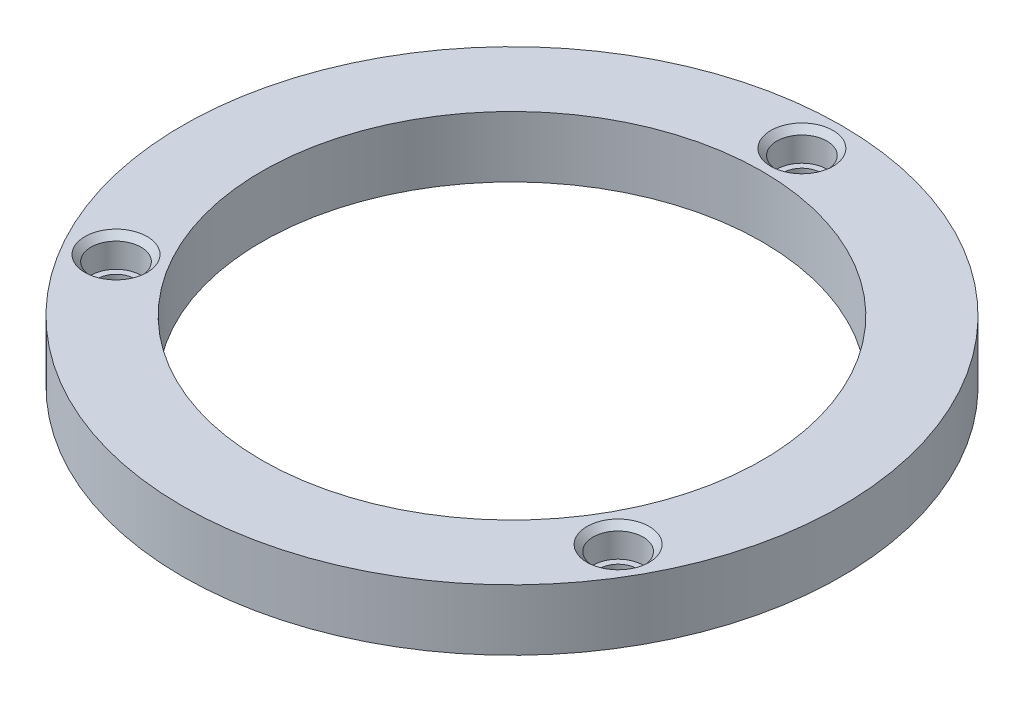
ISO-10303-21;
HEADER;
FILE_DESCRIPTION(('STEP AP214'),'2;1');
FILE_NAME('part.step','',(''),(''),'','','');
FILE_SCHEMA(('AUTOMOTIVE_DESIGN { 1 0 10303 214 1 1 1 1 }'));
ENDSEC;
DATA;
#1=APPLICATION_CONTEXT('core data for automotive mechanical design processes');
#2=APPLICATION_PROTOCOL_DEFINITION('international standard','automotive_design',2000,#1);
#3=PRODUCT_CONTEXT('',#1,'mechanical');
#4=PRODUCT('Part','Part','',(#3));
#5=PRODUCT_RELATED_PRODUCT_CATEGORY('part','',(#4));
#6=PRODUCT_DEFINITION_FORMATION('','',#4);
#7=PRODUCT_DEFINITION_CONTEXT('part definition',#1,'design');
#8=PRODUCT_DEFINITION('design','',#6,#7);
#9=PRODUCT_DEFINITION_SHAPE('','',#8);
#10=(LENGTH_UNIT() NAMED_UNIT(*) SI_UNIT(.MILLI.,.METRE.));
#11=(NAMED_UNIT(*) PLANE_ANGLE_UNIT() SI_UNIT($,.RADIAN.));
#12=(NAMED_UNIT(*) SI_UNIT($,.STERADIAN.) SOLID_ANGLE_UNIT());
#13=UNCERTAINTY_MEASURE_WITH_UNIT(LENGTH_MEASURE(1.E-05),#10,'distance_accuracy_value','');
#14=(GEOMETRIC_REPRESENTATION_CONTEXT(3) GLOBAL_UNCERTAINTY_ASSIGNED_CONTEXT((#13)) GLOBAL_UNIT_ASSIGNED_CONTEXT((#10,
#11,#12)) REPRESENTATION_CONTEXT('',''));
#15=CARTESIAN_POINT('',(0.,0.,0.));
#16=DIRECTION('',(0.,0.,1.));
#17=DIRECTION('',(1.,0.,0.));
#18=AXIS2_PLACEMENT_3D('',#15,#16,#17);
#19=CARTESIAN_POINT('',(0.,10.,0.));
#20=DIRECTION('',(0.,1.,0.));
#21=DIRECTION('',(0.,0.,1.));
#22=AXIS2_PLACEMENT_3D('',#19,#20,#21);
#23=PLANE('',#22);
#24=CARTESIAN_POINT('',(-41.1362066797608,10.,23.75));
#25=DIRECTION('',(0.,1.,0.));
#26=DIRECTION('',(0.,0.,1.));
#27=AXIS2_PLACEMENT_3D('',#24,#25,#26);
#28=CIRCLE('',#27,5.09999999999999);
#29=CARTESIAN_POINT('',(-41.1362066797608,10.,28.85));
#30=VERTEX_POINT('',#29);
#31=EDGE_CURVE('E45',#30,#30,#28,.F.);
#32=ORIENTED_EDGE('',*,*,#31,.T.);
#33=EDGE_LOOP('',(#32));
#34=FACE_BOUND('',#33,.T.);
#35=CARTESIAN_POINT('',(41.1362066797609,10.,23.75));
#36=DIRECTION('',(0.,1.,0.));
#37=DIRECTION('',(0.,0.,1.));
#38=AXIS2_PLACEMENT_3D('',#35,#36,#37);
#39=CIRCLE('',#38,5.09999999999999);
#40=CARTESIAN_POINT('',(41.1362066797609,10.,28.85));
#41=VERTEX_POINT('',#40);
#42=EDGE_CURVE('E49',#41,#41,#39,.F.);
#43=ORIENTED_EDGE('',*,*,#42,.T.);
#44=EDGE_LOOP('',(#43));
#45=FACE_BOUND('',#44,.T.);
#46=CARTESIAN_POINT('',(0.,10.,-47.5));
#47=DIRECTION('',(0.,1.,0.));
#48=DIRECTION('',(0.,0.,1.));
#49=AXIS2_PLACEMENT_3D('',#46,#47,#48);
#50=CIRCLE('',#49,5.09999999999999);
#51=CARTESIAN_POINT('',(0.,10.,-42.4));
#52=VERTEX_POINT('',#51);
#53=EDGE_CURVE('E54',#52,#52,#50,.F.);
#54=ORIENTED_EDGE('',*,*,#53,.T.);
#55=EDGE_LOOP('',(#54));
#56=FACE_BOUND('',#55,.T.);
#57=CARTESIAN_POINT('',(0.,10.,0.));
#58=DIRECTION('',(0.,1.,0.));
#59=DIRECTION('',(0.,0.,1.));
#60=AXIS2_PLACEMENT_3D('',#57,#58,#59);
#61=CIRCLE('',#60,54.);
#62=CARTESIAN_POINT('',(0.,10.,54.));
#63=VERTEX_POINT('',#62);
#64=EDGE_CURVE('E60',#63,#63,#61,.T.);
#65=ORIENTED_EDGE('',*,*,#64,.T.);
#66=EDGE_LOOP('',(#65));
#67=FACE_BOUND('',#66,.T.);
#68=CARTESIAN_POINT('',(0.,10.,0.));
#69=DIRECTION('',(0.,1.,0.));
#70=DIRECTION('',(0.,0.,1.));
#71=AXIS2_PLACEMENT_3D('',#68,#69,#70);
#72=CIRCLE('',#71,41.);
#73=CARTESIAN_POINT('',(0.,10.,41.));
#74=VERTEX_POINT('',#73);
#75=EDGE_CURVE('E64',#74,#74,#72,.T.);
#76=ORIENTED_EDGE('',*,*,#75,.F.);
#77=EDGE_LOOP('',(#76));
#78=FACE_BOUND('',#77,.T.);
#79=ADVANCED_FACE('F33',(#34,#45,#56,#67,#78),#23,.T.);
#80=CARTESIAN_POINT('',(0.,0.,0.));
#81=DIRECTION('',(0.,1.,0.));
#82=DIRECTION('',(0.,0.,1.));
#83=AXIS2_PLACEMENT_3D('',#80,#81,#82);
#84=PLANE('',#83);
#85=CARTESIAN_POINT('',(0.,0.,-47.5));
#86=DIRECTION('',(0.,1.,0.));
#87=DIRECTION('',(0.,0.,1.));
#88=AXIS2_PLACEMENT_3D('',#85,#86,#87);
#89=CIRCLE('',#88,3.1);
#90=CARTESIAN_POINT('',(0.,0.,-44.4));
#91=VERTEX_POINT('',#90);
#92=EDGE_CURVE('E77',#91,#91,#89,.F.);
#93=ORIENTED_EDGE('',*,*,#92,.F.);
#94=EDGE_LOOP('',(#93));
#95=FACE_BOUND('',#94,.T.);
#96=CARTESIAN_POINT('',(41.1362066797639,0.,23.7499999999983));
#97=DIRECTION('',(0.,1.,0.));
#98=DIRECTION('',(0.,0.,1.));
#99=AXIS2_PLACEMENT_3D('',#96,#97,#98);
#100=CIRCLE('',#99,3.1);
#101=CARTESIAN_POINT('',(41.1362066797639,0.,26.8499999999983));
#102=VERTEX_POINT('',#101);
#103=EDGE_CURVE('E89',#102,#102,#100,.F.);
#104=ORIENTED_EDGE('',*,*,#103,.F.);
#105=EDGE_LOOP('',(#104));
#106=FACE_BOUND('',#105,.T.);
#107=CARTESIAN_POINT('',(-41.1362066797578,0.,23.7500000000018));
#108=DIRECTION('',(0.,1.,0.));
#109=DIRECTION('',(0.,0.,1.));
#110=AXIS2_PLACEMENT_3D('',#107,#108,#109);
#111=CIRCLE('',#110,3.1);
#112=CARTESIAN_POINT('',(-41.1362066797578,0.,26.8500000000018));
#113=VERTEX_POINT('',#112);
#114=EDGE_CURVE('E82',#113,#113,#111,.F.);
#115=ORIENTED_EDGE('',*,*,#114,.F.);
#116=EDGE_LOOP('',(#115));
#117=FACE_BOUND('',#116,.T.);
#118=CARTESIAN_POINT('',(0.,0.,0.));
#119=DIRECTION('',(0.,1.,0.));
#120=DIRECTION('',(0.,0.,1.));
#121=AXIS2_PLACEMENT_3D('',#118,#119,#120);
#122=CIRCLE('',#121,54.);
#123=CARTESIAN_POINT('',(0.,0.,54.));
#124=VERTEX_POINT('',#123);
#125=EDGE_CURVE('E61',#124,#124,#122,.T.);
#126=ORIENTED_EDGE('',*,*,#125,.F.);
#127=EDGE_LOOP('',(#126));
#128=FACE_BOUND('',#127,.T.);
#129=CARTESIAN_POINT('',(0.,0.,0.));
#130=DIRECTION('',(0.,1.,0.));
#131=DIRECTION('',(0.,0.,1.));
#132=AXIS2_PLACEMENT_3D('',#129,#130,#131);
#133=CIRCLE('',#132,41.);
#134=CARTESIAN_POINT('',(0.,0.,41.));
#135=VERTEX_POINT('',#134);
#136=EDGE_CURVE('E67',#135,#135,#133,.T.);
#137=ORIENTED_EDGE('',*,*,#136,.T.);
#138=EDGE_LOOP('',(#137));
#139=FACE_BOUND('',#138,.T.);
#140=ADVANCED_FACE('F121',(#95,#106,#117,#128,#139),#84,.F.);
#141=CARTESIAN_POINT('',(0.,10.,0.));
#142=DIRECTION('',(0.,-1.,0.));
#143=DIRECTION('',(0.,0.,-1.));
#144=AXIS2_PLACEMENT_3D('',#141,#142,#143);
#145=CYLINDRICAL_SURFACE('',#144,54.);
#146=ORIENTED_EDGE('',*,*,#64,.F.);
#147=EDGE_LOOP('',(#146));
#148=FACE_BOUND('',#147,.T.);
#149=ORIENTED_EDGE('',*,*,#125,.T.);
#150=EDGE_LOOP('',(#149));
#151=FACE_BOUND('',#150,.T.);
#152=ADVANCED_FACE('F127',(#148,#151),#145,.T.);
#153=CARTESIAN_POINT('',(0.,10.,0.));
#154=DIRECTION('',(0.,-1.,0.));
#155=DIRECTION('',(0.,0.,-1.));
#156=AXIS2_PLACEMENT_3D('',#153,#154,#155);
#157=CYLINDRICAL_SURFACE('',#156,41.);
#158=ORIENTED_EDGE('',*,*,#75,.T.);
#159=EDGE_LOOP('',(#158));
#160=FACE_BOUND('',#159,.T.);
#161=ORIENTED_EDGE('',*,*,#136,.F.);
#162=EDGE_LOOP('',(#161));
#163=FACE_BOUND('',#162,.T.);
#164=ADVANCED_FACE('F132',(#160,#163),#157,.F.);
#165=CARTESIAN_POINT('',(-41.1362066797608,5.,23.75));
#166=DIRECTION('',(0.,1.,0.));
#167=DIRECTION('',(0.,0.,1.));
#168=AXIS2_PLACEMENT_3D('',#165,#166,#167);
#169=CYLINDRICAL_SURFACE('',#168,4.1);
#170=CARTESIAN_POINT('',(-41.1362066797608,9.00000000000001,23.75));
#171=DIRECTION('',(0.,1.,0.));
#172=DIRECTION('',(0.,0.,1.));
#173=AXIS2_PLACEMENT_3D('',#170,#171,#172);
#174=CIRCLE('',#173,4.1);
#175=CARTESIAN_POINT('',(-41.1362066797608,9.00000000000001,27.85));
#176=VERTEX_POINT('',#175);
#177=EDGE_CURVE('E57',#176,#176,#174,.T.);
#178=ORIENTED_EDGE('',*,*,#177,.T.);
#179=EDGE_LOOP('',(#178));
#180=FACE_BOUND('',#179,.T.);
#181=CARTESIAN_POINT('',(-41.1362066797608,5.,23.75));
#182=DIRECTION('',(0.,1.,0.));
#183=DIRECTION('',(0.,0.,1.));
#184=AXIS2_PLACEMENT_3D('',#181,#182,#183);
#185=CIRCLE('',#184,4.1);
#186=CARTESIAN_POINT('',(-41.1362066797608,5.,27.85));
#187=VERTEX_POINT('',#186);
#188=EDGE_CURVE('E73',#187,#187,#185,.T.);
#189=ORIENTED_EDGE('',*,*,#188,.F.);
#190=EDGE_LOOP('',(#189));
#191=FACE_BOUND('',#190,.T.);
#192=ADVANCED_FACE('F165',(#180,#191),#169,.F.);
#193=CARTESIAN_POINT('',(-41.1362066797608,5.,23.75));
#194=DIRECTION('',(0.,1.,0.));
#195=DIRECTION('',(0.,0.,1.));
#196=AXIS2_PLACEMENT_3D('',#193,#194,#195);
#197=PLANE('',#196);
#198=CARTESIAN_POINT('',(-41.1362066797578,5.,23.7500000000018));
#199=DIRECTION('',(0.,1.,0.));
#200=DIRECTION('',(0.,0.,1.));
#201=AXIS2_PLACEMENT_3D('',#198,#199,#200);
#202=CIRCLE('',#201,3.1);
#203=CARTESIAN_POINT('',(-41.1362066797578,5.,26.8500000000018));
#204=VERTEX_POINT('',#203);
#205=EDGE_CURVE('E86',#204,#204,#202,.T.);
#206=ORIENTED_EDGE('',*,*,#205,.F.);
#207=EDGE_LOOP('',(#206));
#208=FACE_BOUND('',#207,.T.);
#209=ORIENTED_EDGE('',*,*,#188,.T.);
#210=EDGE_LOOP('',(#209));
#211=FACE_BOUND('',#210,.T.);
#212=ADVANCED_FACE('F171',(#208,#211),#197,.T.);
#213=CARTESIAN_POINT('',(41.1362066797609,5.,23.75));
#214=DIRECTION('',(0.,1.,0.));
#215=DIRECTION('',(0.,0.,1.));
#216=AXIS2_PLACEMENT_3D('',#213,#214,#215);
#217=CYLINDRICAL_SURFACE('',#216,4.1);
#218=CARTESIAN_POINT('',(41.1362066797609,9.00000000000001,23.75));
#219=DIRECTION('',(0.,1.,0.));
#220=DIRECTION('',(0.,0.,1.));
#221=AXIS2_PLACEMENT_3D('',#218,#219,#220);
#222=CIRCLE('',#221,4.1);
#223=CARTESIAN_POINT('',(41.1362066797609,9.00000000000001,27.85));
#224=VERTEX_POINT('',#223);
#225=EDGE_CURVE('E41',#224,#224,#222,.T.);
#226=ORIENTED_EDGE('',*,*,#225,.T.);
#227=EDGE_LOOP('',(#226));
#228=FACE_BOUND('',#227,.T.);
#229=CARTESIAN_POINT('',(41.1362066797609,5.,23.75));
#230=DIRECTION('',(0.,1.,0.));
#231=DIRECTION('',(0.,0.,1.));
#232=AXIS2_PLACEMENT_3D('',#229,#230,#231);
#233=CIRCLE('',#232,4.1);
#234=CARTESIAN_POINT('',(41.1362066797609,5.,27.85));
#235=VERTEX_POINT('',#234);
#236=EDGE_CURVE('E76',#235,#235,#233,.T.);
#237=ORIENTED_EDGE('',*,*,#236,.F.);
#238=EDGE_LOOP('',(#237));
#239=FACE_BOUND('',#238,.T.);
#240=ADVANCED_FACE('F117',(#228,#239),#217,.F.);
#241=CARTESIAN_POINT('',(41.1362066797609,5.,23.75));
#242=DIRECTION('',(0.,1.,0.));
#243=DIRECTION('',(0.,0.,1.));
#244=AXIS2_PLACEMENT_3D('',#241,#242,#243);
#245=PLANE('',#244);
#246=CARTESIAN_POINT('',(41.1362066797639,5.,23.7499999999983));
#247=DIRECTION('',(0.,1.,0.));
#248=DIRECTION('',(0.,0.,1.));
#249=AXIS2_PLACEMENT_3D('',#246,#247,#248);
#250=CIRCLE('',#249,3.1);
#251=CARTESIAN_POINT('',(41.1362066797639,5.,26.8499999999983));
#252=VERTEX_POINT('',#251);
#253=EDGE_CURVE('E85',#252,#252,#250,.T.);
#254=ORIENTED_EDGE('',*,*,#253,.F.);
#255=EDGE_LOOP('',(#254));
#256=FACE_BOUND('',#255,.T.);
#257=ORIENTED_EDGE('',*,*,#236,.T.);
#258=EDGE_LOOP('',(#257));
#259=FACE_BOUND('',#258,.T.);
#260=ADVANCED_FACE('F112',(#256,#259),#245,.T.);
#261=CARTESIAN_POINT('',(0.,5.,-47.5));
#262=DIRECTION('',(0.,1.,0.));
#263=DIRECTION('',(0.,0.,1.));
#264=AXIS2_PLACEMENT_3D('',#261,#262,#263);
#265=CYLINDRICAL_SURFACE('',#264,4.1);
#266=CARTESIAN_POINT('',(0.,9.00000000000001,-47.5));
#267=DIRECTION('',(0.,1.,0.));
#268=DIRECTION('',(0.,0.,1.));
#269=AXIS2_PLACEMENT_3D('',#266,#267,#268);
#270=CIRCLE('',#269,4.1);
#271=CARTESIAN_POINT('',(0.,9.00000000000001,-43.4));
#272=VERTEX_POINT('',#271);
#273=EDGE_CURVE('E10',#272,#272,#270,.T.);
#274=ORIENTED_EDGE('',*,*,#273,.T.);
#275=EDGE_LOOP('',(#274));
#276=FACE_BOUND('',#275,.T.);
#277=CARTESIAN_POINT('',(0.,5.,-47.5));
#278=DIRECTION('',(0.,1.,0.));
#279=DIRECTION('',(0.,0.,1.));
#280=AXIS2_PLACEMENT_3D('',#277,#278,#279);
#281=CIRCLE('',#280,4.1);
#282=CARTESIAN_POINT('',(0.,5.,-43.4));
#283=VERTEX_POINT('',#282);
#284=EDGE_CURVE('E70',#283,#283,#281,.T.);
#285=ORIENTED_EDGE('',*,*,#284,.F.);
#286=EDGE_LOOP('',(#285));
#287=FACE_BOUND('',#286,.T.);
#288=ADVANCED_FACE('F107',(#276,#287),#265,.F.);
#289=CARTESIAN_POINT('',(0.,5.,-47.5));
#290=DIRECTION('',(0.,1.,0.));
#291=DIRECTION('',(0.,0.,1.));
#292=AXIS2_PLACEMENT_3D('',#289,#290,#291);
#293=PLANE('',#292);
#294=CARTESIAN_POINT('',(0.,5.,-47.5));
#295=DIRECTION('',(0.,1.,0.));
#296=DIRECTION('',(0.,0.,1.));
#297=AXIS2_PLACEMENT_3D('',#294,#295,#296);
#298=CIRCLE('',#297,3.1);
#299=CARTESIAN_POINT('',(0.,5.,-44.4));
#300=VERTEX_POINT('',#299);
#301=EDGE_CURVE('E92',#300,#300,#298,.T.);
#302=ORIENTED_EDGE('',*,*,#301,.F.);
#303=EDGE_LOOP('',(#302));
#304=FACE_BOUND('',#303,.T.);
#305=ORIENTED_EDGE('',*,*,#284,.T.);
#306=EDGE_LOOP('',(#305));
#307=FACE_BOUND('',#306,.T.);
#308=ADVANCED_FACE('F103',(#304,#307),#293,.T.);
#309=CARTESIAN_POINT('',(-41.1362066797578,-0.00100000000000013,23.7500000000018));
#310=DIRECTION('',(0.,1.,0.));
#311=DIRECTION('',(0.,0.,1.));
#312=AXIS2_PLACEMENT_3D('',#309,#310,#311);
#313=CYLINDRICAL_SURFACE('',#312,3.1);
#314=ORIENTED_EDGE('',*,*,#205,.T.);
#315=EDGE_LOOP('',(#314));
#316=FACE_BOUND('',#315,.T.);
#317=ORIENTED_EDGE('',*,*,#114,.T.);
#318=EDGE_LOOP('',(#317));
#319=FACE_BOUND('',#318,.T.);
#320=ADVANCED_FACE('F106',(#316,#319),#313,.F.);
#321=CARTESIAN_POINT('',(41.1362066797639,-0.00100000000000013,23.7499999999983));
#322=DIRECTION('',(0.,1.,0.));
#323=DIRECTION('',(0.,0.,1.));
#324=AXIS2_PLACEMENT_3D('',#321,#322,#323);
#325=CYLINDRICAL_SURFACE('',#324,3.1);
#326=ORIENTED_EDGE('',*,*,#253,.T.);
#327=EDGE_LOOP('',(#326));
#328=FACE_BOUND('',#327,.T.);
#329=ORIENTED_EDGE('',*,*,#103,.T.);
#330=EDGE_LOOP('',(#329));
#331=FACE_BOUND('',#330,.T.);
#332=ADVANCED_FACE('F211',(#328,#331),#325,.F.);
#333=CARTESIAN_POINT('',(0.,-0.00100000000000013,-47.5));
#334=DIRECTION('',(0.,1.,0.));
#335=DIRECTION('',(0.,0.,1.));
#336=AXIS2_PLACEMENT_3D('',#333,#334,#335);
#337=CYLINDRICAL_SURFACE('',#336,3.1);
#338=ORIENTED_EDGE('',*,*,#301,.T.);
#339=EDGE_LOOP('',(#338));
#340=FACE_BOUND('',#339,.T.);
#341=ORIENTED_EDGE('',*,*,#92,.T.);
#342=EDGE_LOOP('',(#341));
#343=FACE_BOUND('',#342,.T.);
#344=ADVANCED_FACE('F100',(#340,#343),#337,.F.);
#345=CARTESIAN_POINT('',(-41.1362066797608,9.00000000000001,23.75));
#346=DIRECTION('',(0.,1.,0.));
#347=DIRECTION('',(0.,0.,1.));
#348=AXIS2_PLACEMENT_3D('',#345,#346,#347);
#349=CONICAL_SURFACE('',#348,4.1,0.785398163397448);
#350=ORIENTED_EDGE('',*,*,#31,.F.);
#351=EDGE_LOOP('',(#350));
#352=FACE_BOUND('',#351,.T.);
#353=ORIENTED_EDGE('',*,*,#177,.F.);
#354=EDGE_LOOP('',(#353));
#355=FACE_BOUND('',#354,.T.);
#356=ADVANCED_FACE('F139',(#352,#355),#349,.F.);
#357=CARTESIAN_POINT('',(41.1362066797609,9.00000000000001,23.75));
#358=DIRECTION('',(0.,1.,0.));
#359=DIRECTION('',(0.,0.,1.));
#360=AXIS2_PLACEMENT_3D('',#357,#358,#359);
#361=CONICAL_SURFACE('',#360,4.1,0.785398163397448);
#362=ORIENTED_EDGE('',*,*,#42,.F.);
#363=EDGE_LOOP('',(#362));
#364=FACE_BOUND('',#363,.T.);
#365=ORIENTED_EDGE('',*,*,#225,.F.);
#366=EDGE_LOOP('',(#365));
#367=FACE_BOUND('',#366,.T.);
#368=ADVANCED_FACE('F144',(#364,#367),#361,.F.);
#369=CARTESIAN_POINT('',(0.,9.00000000000001,-47.5));
#370=DIRECTION('',(0.,1.,0.));
#371=DIRECTION('',(0.,0.,1.));
#372=AXIS2_PLACEMENT_3D('',#369,#370,#371);
#373=CONICAL_SURFACE('',#372,4.1,0.785398163397448);
#374=ORIENTED_EDGE('',*,*,#53,.F.);
#375=EDGE_LOOP('',(#374));
#376=FACE_BOUND('',#375,.T.);
#377=ORIENTED_EDGE('',*,*,#273,.F.);
#378=EDGE_LOOP('',(#377));
#379=FACE_BOUND('',#378,.T.);
#380=ADVANCED_FACE('F36',(#376,#379),#373,.F.);
#381=CLOSED_SHELL('',(#79,#140,#152,#164,#192,#212,#240,#260,#288,#308,#320,#332,#344,#356,#368,#380));
#382=MANIFOLD_SOLID_BREP('B2',#381);
#383=ADVANCED_BREP_SHAPE_REPRESENTATION('',(#18,#382),#14);
#384=SHAPE_DEFINITION_REPRESENTATION(#9,#383);
ENDSEC;
END-ISO-10303-21;
